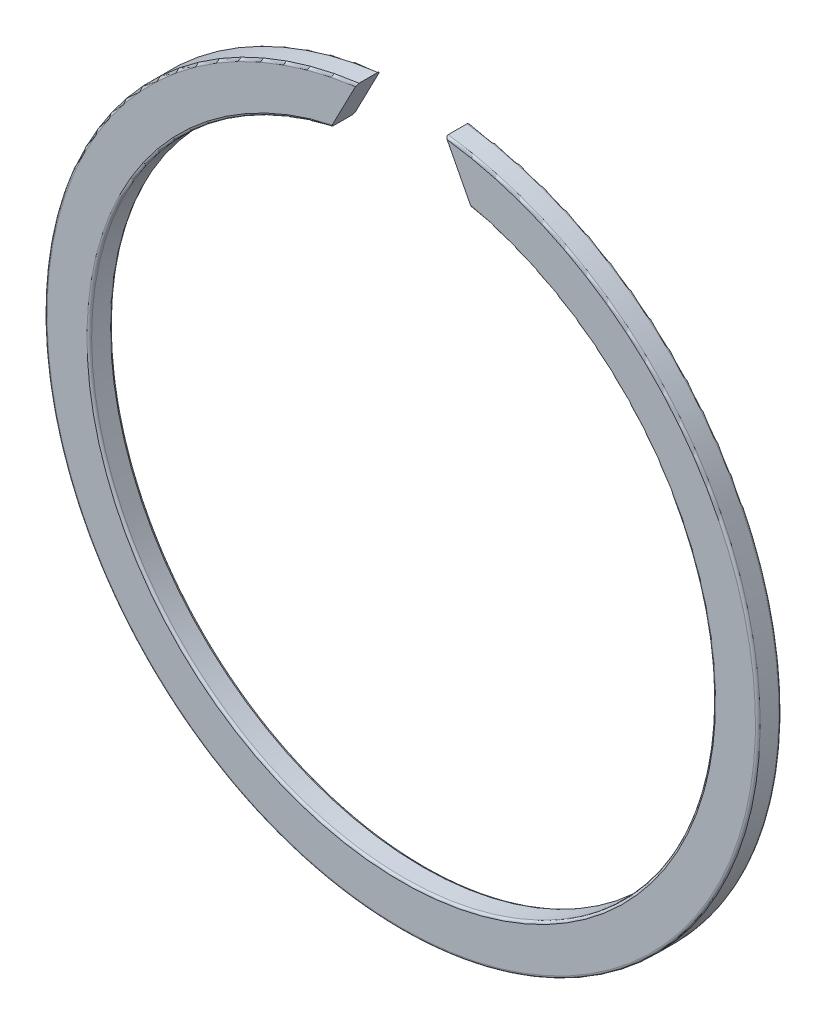
ISO-10303-21;
HEADER;
FILE_DESCRIPTION(('STEP AP214'),'2;1');
FILE_NAME('part.step','',(''),(''),'','','');
FILE_SCHEMA(('AUTOMOTIVE_DESIGN { 1 0 10303 214 1 1 1 1 }'));
ENDSEC;
DATA;
#1=APPLICATION_CONTEXT('core data for automotive mechanical design processes');
#2=APPLICATION_PROTOCOL_DEFINITION('international standard','automotive_design',2000,#1);
#3=PRODUCT_CONTEXT('',#1,'mechanical');
#4=PRODUCT('Part','Part','',(#3));
#5=PRODUCT_RELATED_PRODUCT_CATEGORY('part','',(#4));
#6=PRODUCT_DEFINITION_FORMATION('','',#4);
#7=PRODUCT_DEFINITION_CONTEXT('part definition',#1,'design');
#8=PRODUCT_DEFINITION('design','',#6,#7);
#9=PRODUCT_DEFINITION_SHAPE('','',#8);
#10=(LENGTH_UNIT() NAMED_UNIT(*) SI_UNIT(.MILLI.,.METRE.));
#11=(NAMED_UNIT(*) PLANE_ANGLE_UNIT() SI_UNIT($,.RADIAN.));
#12=(NAMED_UNIT(*) SI_UNIT($,.STERADIAN.) SOLID_ANGLE_UNIT());
#13=UNCERTAINTY_MEASURE_WITH_UNIT(LENGTH_MEASURE(1.E-05),#10,'distance_accuracy_value','');
#14=(GEOMETRIC_REPRESENTATION_CONTEXT(3) GLOBAL_UNCERTAINTY_ASSIGNED_CONTEXT((#13)) GLOBAL_UNIT_ASSIGNED_CONTEXT((#10,
#11,#12)) REPRESENTATION_CONTEXT('',''));
#15=CARTESIAN_POINT('',(0.,0.,0.));
#16=DIRECTION('',(0.,0.,1.));
#17=DIRECTION('',(1.,0.,0.));
#18=AXIS2_PLACEMENT_3D('',#15,#16,#17);
#19=CARTESIAN_POINT('',(0.,0.,2.5));
#20=DIRECTION('',(0.,0.,-1.));
#21=DIRECTION('',(-1.,0.,0.));
#22=AXIS2_PLACEMENT_3D('',#19,#20,#21);
#23=CYLINDRICAL_SURFACE('',#22,33.2499999999999);
#24=DIRECTION('',(0.,0.,-1.));
#25=VECTOR('',#24,1.);
#26=CARTESIAN_POINT('',(7.5,32.393093399674,2.5));
#27=LINE('',#26,#25);
#28=CARTESIAN_POINT('',(7.5,32.393093399674,2.25));
#29=VERTEX_POINT('',#28);
#30=CARTESIAN_POINT('',(7.5,32.393093399674,0.25));
#31=VERTEX_POINT('',#30);
#32=EDGE_CURVE('E219',#29,#31,#27,.T.);
#33=ORIENTED_EDGE('',*,*,#32,.T.);
#34=CARTESIAN_POINT('',(0.,0.,0.25));
#35=DIRECTION('',(0.,0.,1.));
#36=DIRECTION('',(1.,0.,0.));
#37=AXIS2_PLACEMENT_3D('',#34,#35,#36);
#38=CIRCLE('',#37,33.2499999999999);
#39=CARTESIAN_POINT('',(-7.5,32.393093399674,0.25));
#40=VERTEX_POINT('',#39);
#41=EDGE_CURVE('E119',#31,#40,#38,.F.);
#42=ORIENTED_EDGE('',*,*,#41,.T.);
#43=DIRECTION('',(0.,0.,-1.));
#44=VECTOR('',#43,1.);
#45=CARTESIAN_POINT('',(-7.5,32.393093399674,2.5));
#46=LINE('',#45,#44);
#47=CARTESIAN_POINT('',(-7.5,32.393093399674,2.25));
#48=VERTEX_POINT('',#47);
#49=EDGE_CURVE('E103',#48,#40,#46,.T.);
#50=ORIENTED_EDGE('',*,*,#49,.F.);
#51=CARTESIAN_POINT('',(0.,0.,2.25));
#52=DIRECTION('',(0.,0.,1.));
#53=DIRECTION('',(1.,0.,0.));
#54=AXIS2_PLACEMENT_3D('',#51,#52,#53);
#55=CIRCLE('',#54,33.2499999999999);
#56=EDGE_CURVE('E116',#48,#29,#55,.T.);
#57=ORIENTED_EDGE('',*,*,#56,.T.);
#58=EDGE_LOOP('',(#33,#42,#50,#57));
#59=FACE_BOUND('',#58,.T.);
#60=ADVANCED_FACE('F33',(#59),#23,.F.);
#61=CARTESIAN_POINT('',(-4.75,37.7019561826704,2.5));
#62=DIRECTION('',(-0.887941984986797,0.459955466646182,0.));
#63=DIRECTION('',(-0.459955466646183,-0.887941984986797,0.));
#64=AXIS2_PLACEMENT_3D('',#61,#62,#63);
#65=PLANE('',#64);
#66=ORIENTED_EDGE('',*,*,#49,.T.);
#67=CARTESIAN_POINT('',(-7.5,32.393093399674,0.25));
#68=CARTESIAN_POINT('',(-7.5000111446495,32.3930718849776,0.238272967943821));
#69=CARTESIAN_POINT('',(-7.49950227017732,32.3940542648854,0.226569455366621));
#70=CARTESIAN_POINT('',(-7.49753952665525,32.3978433325352,0.203626842312754));
#71=CARTESIAN_POINT('',(-7.49609250242379,32.4006368063856,0.192385000283737));
#72=CARTESIAN_POINT('',(-7.49234995284019,32.4078617817303,0.170626756460508));
#73=CARTESIAN_POINT('',(-7.49005618335156,32.4122898935379,0.160108906526291));
#74=CARTESIAN_POINT('',(-7.48474798744332,32.4225373421568,0.139958303918898));
#75=CARTESIAN_POINT('',(-7.48173222740091,32.4283592535211,0.130327235389141));
#76=CARTESIAN_POINT('',(-7.47399711198114,32.4432918594753,0.109011530734099));
#77=CARTESIAN_POINT('',(-7.46904584294503,32.4528502623533,0.0977245758925532));
#78=CARTESIAN_POINT('',(-7.45836672805747,32.4734662462012,0.077052342694987));
#79=CARTESIAN_POINT('',(-7.45263768998225,32.4845261287539,0.0676700401360347));
#80=CARTESIAN_POINT('',(-7.43887631851653,32.511092395233,0.0483412580775749));
#81=CARTESIAN_POINT('',(-7.43065810860962,32.5269576129485,0.0390214951274539));
#82=CARTESIAN_POINT('',(-7.41363369436794,32.5598231690103,0.0233970099156605));
#83=CARTESIAN_POINT('',(-7.40482659849393,32.5768252284691,0.0170969827740113));
#84=CARTESIAN_POINT('',(-7.3882416535166,32.6088423910685,0.00813752021200648));
#85=CARTESIAN_POINT('',(-7.38050906353963,32.6237701216666,0.00507214658593392));
#86=CARTESIAN_POINT('',(-7.36497172494806,32.6537648847923,0.00101196861482171));
#87=CARTESIAN_POINT('',(-7.35716759596532,32.6688307211233,6.01386432908509E-06));
#88=CARTESIAN_POINT('',(-7.34936559758385,32.6838924443379,0.));
#89=B_SPLINE_CURVE_WITH_KNOTS('',3,(#67,#68,#69,#70,#71,#72,#73,#74,#75,#76,#77,#78,#79,#80,#81,
#82,#83,#84,#85,#86,#87,#88),.UNSPECIFIED.,.F.,.F.,(4,2,2,2,2,2,2,2,2,2,4),(0.,
0.0350917502687142,0.069930306467029,0.104697021417225,0.139528457940121,0.186066180298223,
0.232676062116706,0.292814999042069,0.353047139786037,0.404189224096907,0.455053667225436),.UNSPECIFIED.);
#90=CARTESIAN_POINT('',(-7.34936559758386,32.6838924443379,0.));
#91=VERTEX_POINT('',#90);
#92=EDGE_CURVE('E110',#40,#91,#89,.T.);
#93=ORIENTED_EDGE('',*,*,#92,.T.);
#94=DIRECTION('',(0.459955466646182,0.887941984986796,0.));
#95=VECTOR('',#94,1.);
#96=CARTESIAN_POINT('',(-4.75,37.7019561826704,0.));
#97=LINE('',#96,#95);
#98=CARTESIAN_POINT('',(-4.88985733725985,37.431962214413,0.));
#99=VERTEX_POINT('',#98);
#100=EDGE_CURVE('E199',#91,#99,#97,.T.);
#101=ORIENTED_EDGE('',*,*,#100,.T.);
#102=CARTESIAN_POINT('',(-4.88985733725985,37.431962214413,0.));
#103=CARTESIAN_POINT('',(-4.88013443028504,37.4507322431334,4.04880616268682E-06));
#104=CARTESIAN_POINT('',(-4.87039604809985,37.4695321466787,0.0018084790343271));
#105=CARTESIAN_POINT('',(-4.8511180856136,37.5067481676152,0.00910686217406999));
#106=CARTESIAN_POINT('',(-4.84158146620155,37.5251585690233,0.0146375208827996));
#107=CARTESIAN_POINT('',(-4.82355888768648,37.5599510767805,0.0291458065270133));
#108=CARTESIAN_POINT('',(-4.81504496656952,37.5763871636733,0.0379572440858961));
#109=CARTESIAN_POINT('',(-4.79900609169417,37.6073501403667,0.0590287776424208));
#110=CARTESIAN_POINT('',(-4.79147641505829,37.6218861476613,0.0712714457110798));
#111=CARTESIAN_POINT('',(-4.78006539975287,37.6439150620144,0.094547475084936));
#112=CARTESIAN_POINT('',(-4.77579352066376,37.6521619056179,0.104681556634547));
#113=CARTESIAN_POINT('',(-4.76806732598815,37.6670772901152,0.126350419673));
#114=CARTESIAN_POINT('',(-4.76461313896805,37.6737455828122,0.137885420998792));
#115=CARTESIAN_POINT('',(-4.75868252015668,37.6851946160804,0.162207109756566));
#116=CARTESIAN_POINT('',(-4.75621360184394,37.6899608519149,0.175002521337213));
#117=CARTESIAN_POINT('',(-4.75245727101449,37.6972124318935,0.20137621413352));
#118=CARTESIAN_POINT('',(-4.75116677182364,37.6997037348483,0.214952350522981));
#119=CARTESIAN_POINT('',(-4.75034016940437,37.7012994871465,0.232195472562961));
#120=CARTESIAN_POINT('',(-4.75021260958132,37.7015457408182,0.235753183493731));
#121=CARTESIAN_POINT('',(-4.75004266608366,37.7018738159855,0.242873361873526));
#122=CARTESIAN_POINT('',(-4.75000016677566,37.7019558607107,0.246435816268281));
#123=CARTESIAN_POINT('',(-4.75,37.7019561826704,0.250000000000001));
#124=B_SPLINE_CURVE_WITH_KNOTS('',3,(#102,#103,#104,#105,#106,#107,#108,#109,#110,#111,#112,
#113,#114,#115,#116,#117,#118,#119,#120,#121,#122,#123),.UNSPECIFIED.,.F.,.F.,(4,2,2,2,2,2,2,2,
2,2,4),(0.,0.0633971360041347,0.127428087425214,0.188579655281144,0.249426081694794,
0.290504880990352,0.3315901348559,0.372982970074863,0.414267069973319,0.424969533108305,
0.435657437140001),.UNSPECIFIED.);
#125=CARTESIAN_POINT('',(-4.75,37.7019561826704,0.25));
#126=VERTEX_POINT('',#125);
#127=EDGE_CURVE('E126',#99,#126,#124,.T.);
#128=ORIENTED_EDGE('',*,*,#127,.T.);
#129=DIRECTION('',(0.,0.,-1.));
#130=VECTOR('',#129,1.);
#131=CARTESIAN_POINT('',(-4.75,37.7019561826704,2.5));
#132=LINE('',#131,#130);
#133=CARTESIAN_POINT('',(-4.75,37.7019561826704,2.25));
#134=VERTEX_POINT('',#133);
#135=EDGE_CURVE('E120',#134,#126,#132,.T.);
#136=ORIENTED_EDGE('',*,*,#135,.F.);
#137=CARTESIAN_POINT('',(-4.75,37.7019561826704,2.25));
#138=CARTESIAN_POINT('',(-4.74999026383198,37.7019749782995,2.26230591212575));
#139=CARTESIAN_POINT('',(-4.75050679744651,37.7009778124514,2.2745940588524));
#140=CARTESIAN_POINT('',(-4.75251207823329,37.6971066268011,2.29872431805788));
#141=CARTESIAN_POINT('',(-4.75399560186884,37.6942426910133,2.31056846748552));
#142=CARTESIAN_POINT('',(-4.75785355723337,37.6867949253212,2.33352456390934));
#143=CARTESIAN_POINT('',(-4.76022683131642,37.6822133302472,2.34463744036748));
#144=CARTESIAN_POINT('',(-4.76574759999467,37.6715555108402,2.36592070820159));
#145=CARTESIAN_POINT('',(-4.7688959648712,37.6654776064328,2.37609002233933));
#146=CARTESIAN_POINT('',(-4.77606275914696,37.6516421419222,2.39593318626443));
#147=CARTESIAN_POINT('',(-4.78012401139565,37.6438019124984,2.40553354025566));
#148=CARTESIAN_POINT('',(-4.78883261086923,37.6269899999031,2.42337267333158));
#149=CARTESIAN_POINT('',(-4.79348010847957,37.618018026413,2.43161110179357));
#150=CARTESIAN_POINT('',(-4.80405192642867,37.5976091788281,2.44795108584985));
#151=CARTESIAN_POINT('',(-4.81005960871331,37.586011374867,2.45579739814669));
#152=CARTESIAN_POINT('',(-4.82252671907597,37.5619436736976,2.46956850123602));
#153=CARTESIAN_POINT('',(-4.82898663132421,37.5494728418008,2.47549119308691));
#154=CARTESIAN_POINT('',(-4.84338318583257,37.5216803572798,2.48630745034134));
#155=CARTESIAN_POINT('',(-4.85137845987567,37.506245516259,2.4908318967426));
#156=CARTESIAN_POINT('',(-4.86757718642052,37.4749739466278,2.49725964022594));
#157=CARTESIAN_POINT('',(-4.87578031468076,37.4591378439641,2.49916679122432));
#158=CARTESIAN_POINT('',(-4.88594938795079,37.4395064931929,2.49992706270825));
#159=CARTESIAN_POINT('',(-4.88790366767955,37.4357337648585,2.50000000922624));
#160=CARTESIAN_POINT('',(-4.88985733725984,37.431962214413,2.5));
#161=B_SPLINE_CURVE_WITH_KNOTS('',3,(#137,#138,#139,#140,#141,#142,#143,#144,#145,#146,#147,
#148,#149,#150,#151,#152,#153,#154,#155,#156,#157,#158,#159,#160),.UNSPECIFIED.,.F.,.F.,(4,2,2,
2,2,2,2,2,2,2,2,4),(0.,0.0368385831084216,0.0734798006219201,0.1100735091147,0.146708494373321,
0.185690819966042,0.224683165837524,0.270222563845519,0.315811486124191,0.369490218237684,
0.423089824352396,0.435835395867012),.UNSPECIFIED.);
#162=CARTESIAN_POINT('',(-4.88985733725985,37.431962214413,2.5));
#163=VERTEX_POINT('',#162);
#164=EDGE_CURVE('E111',#134,#163,#161,.T.);
#165=ORIENTED_EDGE('',*,*,#164,.T.);
#166=DIRECTION('',(0.459955466646182,0.887941984986796,0.));
#167=VECTOR('',#166,1.);
#168=CARTESIAN_POINT('',(-4.75,37.7019561826704,2.5));
#169=LINE('',#168,#167);
#170=CARTESIAN_POINT('',(-7.34936559758386,32.6838924443379,2.5));
#171=VERTEX_POINT('',#170);
#172=EDGE_CURVE('E105',#171,#163,#169,.T.);
#173=ORIENTED_EDGE('',*,*,#172,.F.);
#174=CARTESIAN_POINT('',(-7.34936559758386,32.6838924443379,2.5));
#175=CARTESIAN_POINT('',(-7.35905455957171,32.6651879462641,2.49998800061896));
#176=CARTESIAN_POINT('',(-7.36875680093483,32.6464578124152,2.49843814530166));
#177=CARTESIAN_POINT('',(-7.3880060944797,32.6092971367427,2.49215729070028));
#178=CARTESIAN_POINT('',(-7.39755165786118,32.5908694690414,2.48740489798022));
#179=CARTESIAN_POINT('',(-7.41521275931098,32.5567747911528,2.47526799685618));
#180=CARTESIAN_POINT('',(-7.42337449968362,32.5410185876224,2.46820380552233));
#181=CARTESIAN_POINT('',(-7.43906126964321,32.5107353479046,2.45132278857904));
#182=CARTESIAN_POINT('',(-7.44658785643192,32.4962053055462,2.44151296563604));
#183=CARTESIAN_POINT('',(-7.45905537642081,32.4721368135952,2.42165542381541));
#184=CARTESIAN_POINT('',(-7.46419159835985,32.4622213599598,2.41218810062412));
#185=CARTESIAN_POINT('',(-7.47370267126889,32.4438602759623,2.39157957830606));
#186=CARTESIAN_POINT('',(-7.47807825174326,32.4354132372952,2.3804400023048));
#187=CARTESIAN_POINT('',(-7.48513448956216,32.4217912015335,2.35873672905795));
#188=CARTESIAN_POINT('',(-7.48797824214819,32.4163013497996,2.34842433962433));
#189=CARTESIAN_POINT('',(-7.49283932968904,32.4069170418976,2.32692510297271));
#190=CARTESIAN_POINT('',(-7.49485825796699,32.4030195098262,2.31573999188446));
#191=CARTESIAN_POINT('',(-7.497580379841,32.3977644656416,2.2954684646036));
#192=CARTESIAN_POINT('',(-7.49848126072071,32.3960253191056,2.2865064233239));
#193=CARTESIAN_POINT('',(-7.49969409256231,32.3936839526234,2.26836664083037));
#194=CARTESIAN_POINT('',(-7.5000040801434,32.3930855229752,2.25918828274769));
#195=CARTESIAN_POINT('',(-7.5,32.393093399674,2.25));
#196=B_SPLINE_CURVE_WITH_KNOTS('',3,(#174,#175,#176,#177,#178,#179,#180,#181,#182,#183,#184,
#185,#186,#187,#188,#189,#190,#191,#192,#193,#194,#195),.UNSPECIFIED.,.F.,.F.,(4,2,2,2,2,2,2,2,
2,2,4),(0.,0.0631881071017781,0.126802560561209,0.183886032482372,0.240825220698814,
0.284587844433097,0.328308262605989,0.3642352618619,0.40009252856209,0.4275248085837,
0.455048080940462),.UNSPECIFIED.);
#197=EDGE_CURVE('E100',#171,#48,#196,.T.);
#198=ORIENTED_EDGE('',*,*,#197,.T.);
#199=EDGE_LOOP('',(#66,#93,#101,#128,#136,#165,#173,#198));
#200=FACE_BOUND('',#199,.T.);
#201=ADVANCED_FACE('F102',(#200),#65,.F.);
#202=CARTESIAN_POINT('',(0.,0.,2.5));
#203=DIRECTION('',(0.,0.,-1.));
#204=DIRECTION('',(-1.,0.,0.));
#205=AXIS2_PLACEMENT_3D('',#202,#203,#204);
#206=CYLINDRICAL_SURFACE('',#205,38.);
#207=DIRECTION('',(0.,0.,-1.));
#208=VECTOR('',#207,1.);
#209=CARTESIAN_POINT('',(4.75,37.7019561826704,2.5));
#210=LINE('',#209,#208);
#211=CARTESIAN_POINT('',(4.75,37.7019561826704,2.25));
#212=VERTEX_POINT('',#211);
#213=CARTESIAN_POINT('',(4.75,37.7019561826704,0.25));
#214=VERTEX_POINT('',#213);
#215=EDGE_CURVE('E216',#212,#214,#210,.T.);
#216=ORIENTED_EDGE('',*,*,#215,.F.);
#217=CARTESIAN_POINT('',(0.,0.,2.25));
#218=DIRECTION('',(0.,0.,1.));
#219=DIRECTION('',(1.,0.,0.));
#220=AXIS2_PLACEMENT_3D('',#217,#218,#219);
#221=CIRCLE('',#220,38.);
#222=EDGE_CURVE('E11',#212,#134,#221,.F.);
#223=ORIENTED_EDGE('',*,*,#222,.T.);
#224=ORIENTED_EDGE('',*,*,#135,.T.);
#225=CARTESIAN_POINT('',(0.,0.,0.25));
#226=DIRECTION('',(0.,0.,1.));
#227=DIRECTION('',(1.,0.,0.));
#228=AXIS2_PLACEMENT_3D('',#225,#226,#227);
#229=CIRCLE('',#228,38.);
#230=EDGE_CURVE('E42',#126,#214,#229,.T.);
#231=ORIENTED_EDGE('',*,*,#230,.T.);
#232=EDGE_LOOP('',(#216,#223,#224,#231));
#233=FACE_BOUND('',#232,.T.);
#234=ADVANCED_FACE('F142',(#233),#206,.T.);
#235=CARTESIAN_POINT('',(4.75,37.7019561826704,2.5));
#236=DIRECTION('',(0.887941984986797,0.459955466646183,0.));
#237=DIRECTION('',(-0.459955466646183,0.887941984986797,0.));
#238=AXIS2_PLACEMENT_3D('',#235,#236,#237);
#239=PLANE('',#238);
#240=DIRECTION('',(0.459955466646183,-0.887941984986796,0.));
#241=VECTOR('',#240,1.);
#242=CARTESIAN_POINT('',(4.75,37.7019561826704,0.));
#243=LINE('',#242,#241);
#244=CARTESIAN_POINT('',(4.88985733725984,37.431962214413,0.));
#245=VERTEX_POINT('',#244);
#246=CARTESIAN_POINT('',(7.34936559758386,32.6838924443379,0.));
#247=VERTEX_POINT('',#246);
#248=EDGE_CURVE('E204',#245,#247,#243,.T.);
#249=ORIENTED_EDGE('',*,*,#248,.T.);
#250=CARTESIAN_POINT('',(7.34936559758386,32.6838924443379,0.));
#251=CARTESIAN_POINT('',(7.35905455957171,32.6651879462641,1.19993810392461E-05));
#252=CARTESIAN_POINT('',(7.36875680093483,32.6464578124152,0.00156185469834198));
#253=CARTESIAN_POINT('',(7.3880060944797,32.6092971367427,0.00784270929972013));
#254=CARTESIAN_POINT('',(7.39755165786118,32.5908694690414,0.0125951020197757));
#255=CARTESIAN_POINT('',(7.41521275931098,32.5567747911528,0.0247320031438194));
#256=CARTESIAN_POINT('',(7.42337449968362,32.5410185876224,0.0317961944776688));
#257=CARTESIAN_POINT('',(7.43906126964321,32.5107353479046,0.0486772114209547));
#258=CARTESIAN_POINT('',(7.44658785643191,32.4962053055462,0.0584870343639533));
#259=CARTESIAN_POINT('',(7.45905537642081,32.4721368135952,0.0783445761845851));
#260=CARTESIAN_POINT('',(7.46419159835984,32.4622213599598,0.0878118993758744));
#261=CARTESIAN_POINT('',(7.47370267126889,32.4438602759623,0.108420421693927));
#262=CARTESIAN_POINT('',(7.47807825174326,32.4354132372952,0.11955999769519));
#263=CARTESIAN_POINT('',(7.48513448956216,32.4217912015335,0.141263270942038));
#264=CARTESIAN_POINT('',(7.48797824214819,32.4163013497997,0.151575660375659));
#265=CARTESIAN_POINT('',(7.49283932968904,32.4069170418976,0.173074897027282));
#266=CARTESIAN_POINT('',(7.49485825796699,32.4030195098262,0.184260008115534));
#267=CARTESIAN_POINT('',(7.497580379841,32.3977644656416,0.204531535396393));
#268=CARTESIAN_POINT('',(7.49848126072071,32.3960253191056,0.213493576676098));
#269=CARTESIAN_POINT('',(7.49969409256231,32.3936839526234,0.231633359169629));
#270=CARTESIAN_POINT('',(7.5000040801434,32.3930855229752,0.240811717252314));
#271=CARTESIAN_POINT('',(7.5,32.393093399674,0.25));
#272=B_SPLINE_CURVE_WITH_KNOTS('',3,(#250,#251,#252,#253,#254,#255,#256,#257,#258,#259,#260,
#261,#262,#263,#264,#265,#266,#267,#268,#269,#270,#271),.UNSPECIFIED.,.F.,.F.,(4,2,2,2,2,2,2,2,
2,2,4),(0.,0.0631881071017687,0.126802560561207,0.18388603248237,0.240825220698802,
0.284587844433083,0.328308262605976,0.364235261861887,0.400092528562082,0.427524808583693,
0.455048080940458),.UNSPECIFIED.);
#273=EDGE_CURVE('E170',#247,#31,#272,.T.);
#274=ORIENTED_EDGE('',*,*,#273,.T.);
#275=ORIENTED_EDGE('',*,*,#32,.F.);
#276=CARTESIAN_POINT('',(7.5,32.393093399674,2.25));
#277=CARTESIAN_POINT('',(7.5000111446495,32.3930718849776,2.26172703205618));
#278=CARTESIAN_POINT('',(7.49950227017732,32.3940542648854,2.27343054463338));
#279=CARTESIAN_POINT('',(7.49753952665525,32.3978433325352,2.29637315768725));
#280=CARTESIAN_POINT('',(7.49609250242379,32.4006368063856,2.30761499971626));
#281=CARTESIAN_POINT('',(7.49234995284019,32.4078617817303,2.32937324353949));
#282=CARTESIAN_POINT('',(7.49005618335156,32.4122898935379,2.33989109347371));
#283=CARTESIAN_POINT('',(7.48474798744333,32.4225373421568,2.3600416960811));
#284=CARTESIAN_POINT('',(7.48173222740091,32.4283592535211,2.36967276461086));
#285=CARTESIAN_POINT('',(7.47399711198114,32.4432918594753,2.3909884692659));
#286=CARTESIAN_POINT('',(7.46904584294503,32.4528502623533,2.40227542410745));
#287=CARTESIAN_POINT('',(7.45836672805747,32.4734662462012,2.42294765730501));
#288=CARTESIAN_POINT('',(7.45263768998225,32.4845261287539,2.43232995986397));
#289=CARTESIAN_POINT('',(7.43887631851653,32.511092395233,2.45165874192243));
#290=CARTESIAN_POINT('',(7.43065810860962,32.5269576129485,2.46097850487255));
#291=CARTESIAN_POINT('',(7.41363369436794,32.5598231690103,2.47660299008434));
#292=CARTESIAN_POINT('',(7.40482659849393,32.5768252284691,2.48290301722599));
#293=CARTESIAN_POINT('',(7.3882416535166,32.6088423910685,2.49186247978799));
#294=CARTESIAN_POINT('',(7.38050906353963,32.6237701216666,2.49492785341407));
#295=CARTESIAN_POINT('',(7.36497172494807,32.6537648847923,2.49898803138518));
#296=CARTESIAN_POINT('',(7.35716759596532,32.6688307211233,2.49999398613567));
#297=CARTESIAN_POINT('',(7.34936559758386,32.6838924443379,2.5));
#298=B_SPLINE_CURVE_WITH_KNOTS('',3,(#276,#277,#278,#279,#280,#281,#282,#283,#284,#285,#286,
#287,#288,#289,#290,#291,#292,#293,#294,#295,#296,#297),.UNSPECIFIED.,.F.,.F.,(4,2,2,2,2,2,2,2,
2,2,4),(0.,0.0350917502687132,0.0699303064670301,0.104697021417227,0.139528457940122,
0.186066180298225,0.232676062116707,0.292814999042071,0.353047139786039,0.404189224096908,
0.45505366722543),.UNSPECIFIED.);
#299=CARTESIAN_POINT('',(7.34936559758386,32.6838924443379,2.5));
#300=VERTEX_POINT('',#299);
#301=EDGE_CURVE('E124',#29,#300,#298,.T.);
#302=ORIENTED_EDGE('',*,*,#301,.T.);
#303=DIRECTION('',(0.459955466646183,-0.887941984986796,0.));
#304=VECTOR('',#303,1.);
#305=CARTESIAN_POINT('',(4.75,37.7019561826704,2.5));
#306=LINE('',#305,#304);
#307=CARTESIAN_POINT('',(4.88985733725984,37.431962214413,2.5));
#308=VERTEX_POINT('',#307);
#309=EDGE_CURVE('E221',#308,#300,#306,.T.);
#310=ORIENTED_EDGE('',*,*,#309,.F.);
#311=CARTESIAN_POINT('',(4.88985733725984,37.431962214413,2.5));
#312=CARTESIAN_POINT('',(4.88013443028504,37.4507322431334,2.49999595119384));
#313=CARTESIAN_POINT('',(4.87039604809985,37.4695321466787,2.49819152096567));
#314=CARTESIAN_POINT('',(4.8511180856136,37.5067481676152,2.49089313782593));
#315=CARTESIAN_POINT('',(4.84158146620155,37.5251585690233,2.4853624791172));
#316=CARTESIAN_POINT('',(4.82355888768648,37.5599510767805,2.47085419347299));
#317=CARTESIAN_POINT('',(4.81504496656952,37.5763871636733,2.4620427559141));
#318=CARTESIAN_POINT('',(4.79900609169416,37.6073501403667,2.44097122235758));
#319=CARTESIAN_POINT('',(4.79147641505829,37.6218861476613,2.42872855428892));
#320=CARTESIAN_POINT('',(4.78006539975287,37.6439150620144,2.40545252491506));
#321=CARTESIAN_POINT('',(4.77579352066376,37.6521619056179,2.39531844336545));
#322=CARTESIAN_POINT('',(4.76806732598815,37.6670772901152,2.373649580327));
#323=CARTESIAN_POINT('',(4.76461313896805,37.6737455828122,2.36211457900121));
#324=CARTESIAN_POINT('',(4.75868252015668,37.6851946160804,2.33779289024343));
#325=CARTESIAN_POINT('',(4.75621360184394,37.6899608519149,2.32499747866279));
#326=CARTESIAN_POINT('',(4.75245727101449,37.6972124318935,2.29862378586648));
#327=CARTESIAN_POINT('',(4.75116677182364,37.6997037348483,2.28504764947702));
#328=CARTESIAN_POINT('',(4.75034016940436,37.7012994871465,2.26780452743704));
#329=CARTESIAN_POINT('',(4.75021260958132,37.7015457408182,2.26424681650627));
#330=CARTESIAN_POINT('',(4.75004266608366,37.7018738159855,2.25712663812647));
#331=CARTESIAN_POINT('',(4.75000016677566,37.7019558607107,2.25356418373172));
#332=CARTESIAN_POINT('',(4.75,37.7019561826704,2.25));
#333=B_SPLINE_CURVE_WITH_KNOTS('',3,(#311,#312,#313,#314,#315,#316,#317,#318,#319,#320,#321,
#322,#323,#324,#325,#326,#327,#328,#329,#330,#331,#332),.UNSPECIFIED.,.F.,.F.,(4,2,2,2,2,2,2,2,
2,2,4),(0.,0.0633971360041347,0.127428087425214,0.188579655281144,0.249426081694794,
0.290504880990353,0.331590134855901,0.372982970074863,0.414267069973319,0.424969533108306,
0.43565743714),.UNSPECIFIED.);
#334=EDGE_CURVE('E57',#308,#212,#333,.T.);
#335=ORIENTED_EDGE('',*,*,#334,.T.);
#336=ORIENTED_EDGE('',*,*,#215,.T.);
#337=CARTESIAN_POINT('',(4.75,37.7019561826704,0.25));
#338=CARTESIAN_POINT('',(4.74999026383198,37.7019749782995,0.237694087874254));
#339=CARTESIAN_POINT('',(4.75050679744651,37.7009778124514,0.225405941147599));
#340=CARTESIAN_POINT('',(4.75251207823329,37.6971066268011,0.201275681942118));
#341=CARTESIAN_POINT('',(4.75399560186884,37.6942426910133,0.189431532514476));
#342=CARTESIAN_POINT('',(4.75785355723337,37.6867949253212,0.166475436090663));
#343=CARTESIAN_POINT('',(4.76022683131642,37.6822133302472,0.155362559632519));
#344=CARTESIAN_POINT('',(4.76574759999467,37.6715555108402,0.134079291798407));
#345=CARTESIAN_POINT('',(4.7688959648712,37.6654776064328,0.123909977660674));
#346=CARTESIAN_POINT('',(4.77606275914696,37.6516421419222,0.104066813735573));
#347=CARTESIAN_POINT('',(4.78012401139565,37.6438019124984,0.0944664597443383));
#348=CARTESIAN_POINT('',(4.78883261086923,37.6269899999031,0.0766273266684228));
#349=CARTESIAN_POINT('',(4.79348010847957,37.618018026413,0.0683888982064245));
#350=CARTESIAN_POINT('',(4.80405192642867,37.5976091788281,0.0520489141501564));
#351=CARTESIAN_POINT('',(4.8100596087133,37.586011374867,0.0442026018533104));
#352=CARTESIAN_POINT('',(4.82252671907596,37.5619436736976,0.0304314987639826));
#353=CARTESIAN_POINT('',(4.82898663132421,37.5494728418008,0.024508806913092));
#354=CARTESIAN_POINT('',(4.84338318583257,37.5216803572798,0.0136925496586561));
#355=CARTESIAN_POINT('',(4.85137845987567,37.506245516259,0.00916810325739778));
#356=CARTESIAN_POINT('',(4.86757718642052,37.4749739466278,0.00274035977405645));
#357=CARTESIAN_POINT('',(4.87578031468076,37.4591378439641,0.000833208775682036));
#358=CARTESIAN_POINT('',(4.88594938795079,37.4395064931929,7.29372917457277E-05));
#359=CARTESIAN_POINT('',(4.88790366767955,37.4357337648585,-9.2262397443663E-09));
#360=CARTESIAN_POINT('',(4.88985733725984,37.431962214413,0.));
#361=B_SPLINE_CURVE_WITH_KNOTS('',3,(#337,#338,#339,#340,#341,#342,#343,#344,#345,#346,#347,
#348,#349,#350,#351,#352,#353,#354,#355,#356,#357,#358,#359,#360),.UNSPECIFIED.,.F.,.F.,(4,2,2,
2,2,2,2,2,2,2,2,4),(0.,0.0368385831084226,0.0734798006219202,0.1100735091147,0.146708494373325,
0.185690819966041,0.224683165837523,0.27022256384551,0.31581148612419,0.369490218237683,
0.423089824352395,0.435835395867011),.UNSPECIFIED.);
#362=EDGE_CURVE('E49',#214,#245,#361,.T.);
#363=ORIENTED_EDGE('',*,*,#362,.T.);
#364=EDGE_LOOP('',(#249,#274,#275,#302,#310,#335,#336,#363));
#365=FACE_BOUND('',#364,.T.);
#366=ADVANCED_FACE('F179',(#365),#239,.F.);
#367=CARTESIAN_POINT('',(0.,0.,2.5));
#368=DIRECTION('',(0.,0.,1.));
#369=DIRECTION('',(1.,0.,0.));
#370=AXIS2_PLACEMENT_3D('',#367,#368,#369);
#371=PLANE('',#370);
#372=ORIENTED_EDGE('',*,*,#309,.T.);
#373=CARTESIAN_POINT('',(0.,0.,2.5));
#374=DIRECTION('',(0.,0.,1.));
#375=DIRECTION('',(1.,0.,0.));
#376=AXIS2_PLACEMENT_3D('',#373,#374,#375);
#377=CIRCLE('',#376,33.4999999999999);
#378=EDGE_CURVE('E209',#300,#171,#377,.F.);
#379=ORIENTED_EDGE('',*,*,#378,.T.);
#380=ORIENTED_EDGE('',*,*,#172,.T.);
#381=CARTESIAN_POINT('',(0.,0.,2.5));
#382=DIRECTION('',(0.,0.,1.));
#383=DIRECTION('',(1.,0.,0.));
#384=AXIS2_PLACEMENT_3D('',#381,#382,#383);
#385=CIRCLE('',#384,37.75);
#386=EDGE_CURVE('E207',#163,#308,#385,.T.);
#387=ORIENTED_EDGE('',*,*,#386,.T.);
#388=EDGE_LOOP('',(#372,#379,#380,#387));
#389=FACE_BOUND('',#388,.T.);
#390=ADVANCED_FACE('F183',(#389),#371,.T.);
#391=CARTESIAN_POINT('',(0.,0.,0.));
#392=DIRECTION('',(0.,0.,1.));
#393=DIRECTION('',(1.,0.,0.));
#394=AXIS2_PLACEMENT_3D('',#391,#392,#393);
#395=PLANE('',#394);
#396=ORIENTED_EDGE('',*,*,#100,.F.);
#397=CARTESIAN_POINT('',(0.,0.,0.));
#398=DIRECTION('',(0.,0.,1.));
#399=DIRECTION('',(1.,0.,0.));
#400=AXIS2_PLACEMENT_3D('',#397,#398,#399);
#401=CIRCLE('',#400,33.4999999999999);
#402=EDGE_CURVE('E193',#91,#247,#401,.T.);
#403=ORIENTED_EDGE('',*,*,#402,.T.);
#404=ORIENTED_EDGE('',*,*,#248,.F.);
#405=CARTESIAN_POINT('',(0.,0.,0.));
#406=DIRECTION('',(0.,0.,1.));
#407=DIRECTION('',(1.,0.,0.));
#408=AXIS2_PLACEMENT_3D('',#405,#406,#407);
#409=CIRCLE('',#408,37.75);
#410=EDGE_CURVE('E194',#245,#99,#409,.F.);
#411=ORIENTED_EDGE('',*,*,#410,.T.);
#412=EDGE_LOOP('',(#396,#403,#404,#411));
#413=FACE_BOUND('',#412,.T.);
#414=ADVANCED_FACE('F184',(#413),#395,.F.);
#415=CARTESIAN_POINT('',(0.,0.,0.25));
#416=DIRECTION('',(0.,0.,1.));
#417=DIRECTION('',(1.,0.,0.));
#418=AXIS2_PLACEMENT_3D('',#415,#416,#417);
#419=TOROIDAL_SURFACE('',#418,33.4999999999999,0.25);
#420=ORIENTED_EDGE('',*,*,#273,.F.);
#421=ORIENTED_EDGE('',*,*,#402,.F.);
#422=ORIENTED_EDGE('',*,*,#92,.F.);
#423=ORIENTED_EDGE('',*,*,#41,.F.);
#424=EDGE_LOOP('',(#420,#421,#422,#423));
#425=FACE_BOUND('',#424,.T.);
#426=ADVANCED_FACE('F160',(#425),#419,.T.);
#427=CARTESIAN_POINT('',(0.,0.,2.25));
#428=DIRECTION('',(0.,0.,1.));
#429=DIRECTION('',(1.,0.,0.));
#430=AXIS2_PLACEMENT_3D('',#427,#428,#429);
#431=TOROIDAL_SURFACE('',#430,33.4999999999999,0.25);
#432=ORIENTED_EDGE('',*,*,#301,.F.);
#433=ORIENTED_EDGE('',*,*,#56,.F.);
#434=ORIENTED_EDGE('',*,*,#197,.F.);
#435=ORIENTED_EDGE('',*,*,#378,.F.);
#436=EDGE_LOOP('',(#432,#433,#434,#435));
#437=FACE_BOUND('',#436,.T.);
#438=ADVANCED_FACE('F123',(#437),#431,.T.);
#439=CARTESIAN_POINT('',(0.,0.,2.25));
#440=DIRECTION('',(0.,0.,1.));
#441=DIRECTION('',(1.,0.,0.));
#442=AXIS2_PLACEMENT_3D('',#439,#440,#441);
#443=TOROIDAL_SURFACE('',#442,37.75,0.25);
#444=ORIENTED_EDGE('',*,*,#164,.F.);
#445=ORIENTED_EDGE('',*,*,#222,.F.);
#446=ORIENTED_EDGE('',*,*,#334,.F.);
#447=ORIENTED_EDGE('',*,*,#386,.F.);
#448=EDGE_LOOP('',(#444,#445,#446,#447));
#449=FACE_BOUND('',#448,.T.);
#450=ADVANCED_FACE('F159',(#449),#443,.T.);
#451=CARTESIAN_POINT('',(0.,0.,0.25));
#452=DIRECTION('',(0.,0.,1.));
#453=DIRECTION('',(1.,0.,0.));
#454=AXIS2_PLACEMENT_3D('',#451,#452,#453);
#455=TOROIDAL_SURFACE('',#454,37.75,0.25);
#456=ORIENTED_EDGE('',*,*,#127,.F.);
#457=ORIENTED_EDGE('',*,*,#410,.F.);
#458=ORIENTED_EDGE('',*,*,#362,.F.);
#459=ORIENTED_EDGE('',*,*,#230,.F.);
#460=EDGE_LOOP('',(#456,#457,#458,#459));
#461=FACE_BOUND('',#460,.T.);
#462=ADVANCED_FACE('F35',(#461),#455,.T.);
#463=CLOSED_SHELL('',(#60,#201,#234,#366,#390,#414,#426,#438,#450,#462));
#464=MANIFOLD_SOLID_BREP('B2',#463);
#465=ADVANCED_BREP_SHAPE_REPRESENTATION('',(#18,#464),#14);
#466=SHAPE_DEFINITION_REPRESENTATION(#9,#465);
ENDSEC;
END-ISO-10303-21;
